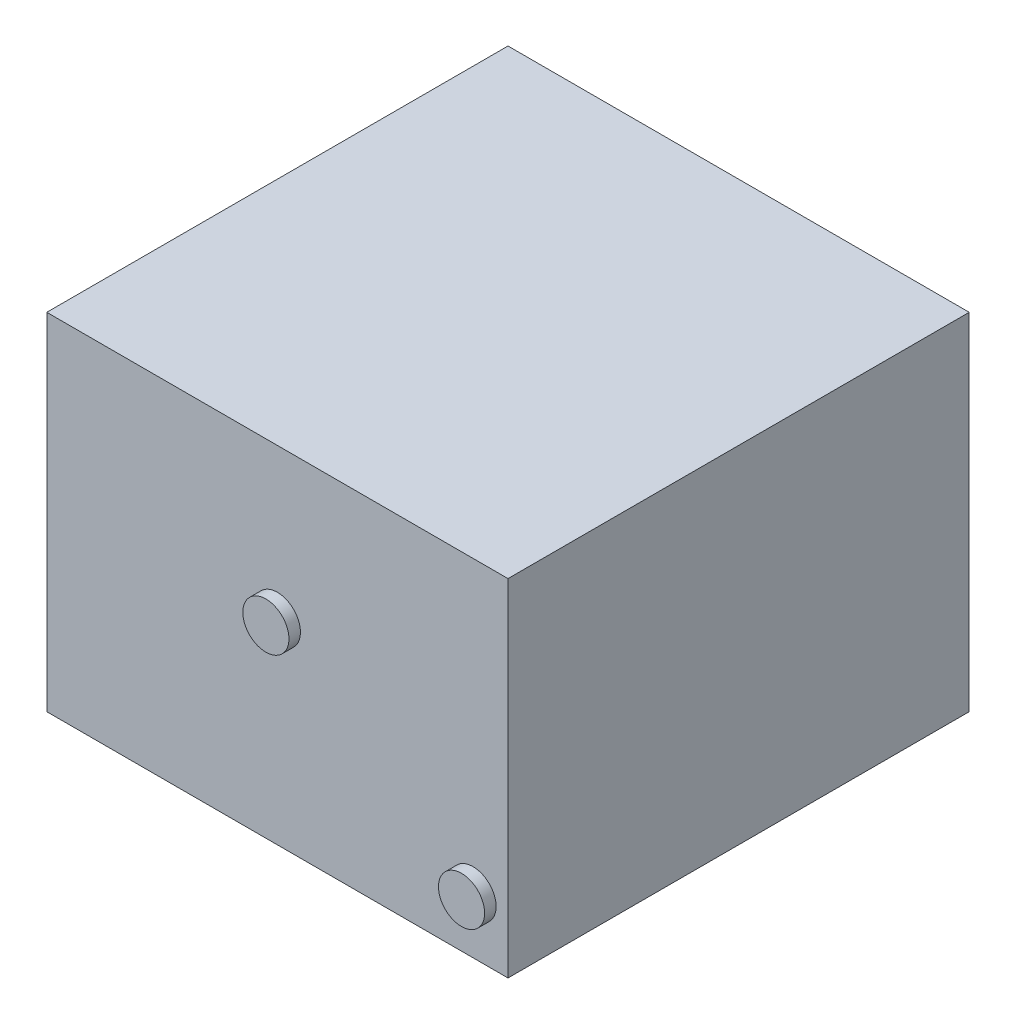
ISO-10303-21;
HEADER;
FILE_DESCRIPTION(('STEP AP214'),'2;1');
FILE_NAME('part.step','',(''),(''),'','','');
FILE_SCHEMA(('AUTOMOTIVE_DESIGN { 1 0 10303 214 1 1 1 1 }'));
ENDSEC;
DATA;
#1=APPLICATION_CONTEXT('core data for automotive mechanical design processes');
#2=APPLICATION_PROTOCOL_DEFINITION('international standard','automotive_design',2000,#1);
#3=PRODUCT_CONTEXT('',#1,'mechanical');
#4=PRODUCT('Part','Part','',(#3));
#5=PRODUCT_RELATED_PRODUCT_CATEGORY('part','',(#4));
#6=PRODUCT_DEFINITION_FORMATION('','',#4);
#7=PRODUCT_DEFINITION_CONTEXT('part definition',#1,'design');
#8=PRODUCT_DEFINITION('design','',#6,#7);
#9=PRODUCT_DEFINITION_SHAPE('','',#8);
#10=(LENGTH_UNIT() NAMED_UNIT(*) SI_UNIT(.MILLI.,.METRE.));
#11=(NAMED_UNIT(*) PLANE_ANGLE_UNIT() SI_UNIT($,.RADIAN.));
#12=(NAMED_UNIT(*) SI_UNIT($,.STERADIAN.) SOLID_ANGLE_UNIT());
#13=UNCERTAINTY_MEASURE_WITH_UNIT(LENGTH_MEASURE(1.E-05),#10,'distance_accuracy_value','');
#14=(GEOMETRIC_REPRESENTATION_CONTEXT(3) GLOBAL_UNCERTAINTY_ASSIGNED_CONTEXT((#13)) GLOBAL_UNIT_ASSIGNED_CONTEXT((#10,
#11,#12)) REPRESENTATION_CONTEXT('',''));
#15=CARTESIAN_POINT('',(0.,0.,0.));
#16=DIRECTION('',(0.,0.,1.));
#17=DIRECTION('',(1.,0.,0.));
#18=AXIS2_PLACEMENT_3D('',#15,#16,#17);
#19=CARTESIAN_POINT('',(100.,-75.,100.));
#20=DIRECTION('',(-1.,0.,0.));
#21=DIRECTION('',(0.,0.,1.));
#22=AXIS2_PLACEMENT_3D('',#19,#20,#21);
#23=PLANE('',#22);
#24=DIRECTION('',(0.,1.,0.));
#25=VECTOR('',#24,1.);
#26=CARTESIAN_POINT('',(100.,-75.,-100.));
#27=LINE('',#26,#25);
#28=CARTESIAN_POINT('',(100.,-75.,-100.));
#29=VERTEX_POINT('',#28);
#30=CARTESIAN_POINT('',(100.,75.,-100.));
#31=VERTEX_POINT('',#30);
#32=EDGE_CURVE('E111',#29,#31,#27,.T.);
#33=ORIENTED_EDGE('',*,*,#32,.T.);
#34=DIRECTION('',(0.,0.,-1.));
#35=VECTOR('',#34,1.);
#36=CARTESIAN_POINT('',(100.,75.,100.));
#37=LINE('',#36,#35);
#38=CARTESIAN_POINT('',(100.,75.,100.));
#39=VERTEX_POINT('',#38);
#40=EDGE_CURVE('E100',#39,#31,#37,.T.);
#41=ORIENTED_EDGE('',*,*,#40,.F.);
#42=DIRECTION('',(0.,1.,0.));
#43=VECTOR('',#42,1.);
#44=CARTESIAN_POINT('',(100.,-75.,100.));
#45=LINE('',#44,#43);
#46=CARTESIAN_POINT('',(100.,-75.,100.));
#47=VERTEX_POINT('',#46);
#48=EDGE_CURVE('E92',#47,#39,#45,.T.);
#49=ORIENTED_EDGE('',*,*,#48,.F.);
#50=DIRECTION('',(0.,0.,-1.));
#51=VECTOR('',#50,1.);
#52=CARTESIAN_POINT('',(100.,-75.,100.));
#53=LINE('',#52,#51);
#54=EDGE_CURVE('E107',#47,#29,#53,.T.);
#55=ORIENTED_EDGE('',*,*,#54,.T.);
#56=EDGE_LOOP('',(#33,#41,#49,#55));
#57=FACE_BOUND('',#56,.T.);
#58=ADVANCED_FACE('F39',(#57),#23,.F.);
#59=CARTESIAN_POINT('',(-100.,75.,100.));
#60=DIRECTION('',(0.,-1.,0.));
#61=DIRECTION('',(0.,0.,-1.));
#62=AXIS2_PLACEMENT_3D('',#59,#60,#61);
#63=PLANE('',#62);
#64=DIRECTION('',(-1.,0.,0.));
#65=VECTOR('',#64,1.);
#66=CARTESIAN_POINT('',(-100.,75.,-100.));
#67=LINE('',#66,#65);
#68=CARTESIAN_POINT('',(-100.,75.,-100.));
#69=VERTEX_POINT('',#68);
#70=EDGE_CURVE('E98',#31,#69,#67,.T.);
#71=ORIENTED_EDGE('',*,*,#70,.T.);
#72=DIRECTION('',(0.,0.,-1.));
#73=VECTOR('',#72,1.);
#74=CARTESIAN_POINT('',(-100.,75.,100.));
#75=LINE('',#74,#73);
#76=CARTESIAN_POINT('',(-100.,75.,100.));
#77=VERTEX_POINT('',#76);
#78=EDGE_CURVE('E96',#77,#69,#75,.T.);
#79=ORIENTED_EDGE('',*,*,#78,.F.);
#80=DIRECTION('',(-1.,0.,0.));
#81=VECTOR('',#80,1.);
#82=CARTESIAN_POINT('',(-100.,75.,100.));
#83=LINE('',#82,#81);
#84=EDGE_CURVE('E87',#39,#77,#83,.T.);
#85=ORIENTED_EDGE('',*,*,#84,.F.);
#86=ORIENTED_EDGE('',*,*,#40,.T.);
#87=EDGE_LOOP('',(#71,#79,#85,#86));
#88=FACE_BOUND('',#87,.T.);
#89=ADVANCED_FACE('F97',(#88),#63,.F.);
#90=CARTESIAN_POINT('',(-100.,-75.,100.));
#91=DIRECTION('',(1.,0.,0.));
#92=DIRECTION('',(0.,0.,-1.));
#93=AXIS2_PLACEMENT_3D('',#90,#91,#92);
#94=PLANE('',#93);
#95=DIRECTION('',(0.,-1.,0.));
#96=VECTOR('',#95,1.);
#97=CARTESIAN_POINT('',(-100.,-75.,-100.));
#98=LINE('',#97,#96);
#99=CARTESIAN_POINT('',(-100.,-75.,-100.));
#100=VERTEX_POINT('',#99);
#101=EDGE_CURVE('E73',#69,#100,#98,.T.);
#102=ORIENTED_EDGE('',*,*,#101,.T.);
#103=DIRECTION('',(0.,0.,-1.));
#104=VECTOR('',#103,1.);
#105=CARTESIAN_POINT('',(-100.,-75.,100.));
#106=LINE('',#105,#104);
#107=CARTESIAN_POINT('',(-100.,-75.,100.));
#108=VERTEX_POINT('',#107);
#109=EDGE_CURVE('E101',#108,#100,#106,.T.);
#110=ORIENTED_EDGE('',*,*,#109,.F.);
#111=DIRECTION('',(0.,-1.,0.));
#112=VECTOR('',#111,1.);
#113=CARTESIAN_POINT('',(-100.,-75.,100.));
#114=LINE('',#113,#112);
#115=EDGE_CURVE('E90',#77,#108,#114,.T.);
#116=ORIENTED_EDGE('',*,*,#115,.F.);
#117=ORIENTED_EDGE('',*,*,#78,.T.);
#118=EDGE_LOOP('',(#102,#110,#116,#117));
#119=FACE_BOUND('',#118,.T.);
#120=ADVANCED_FACE('F103',(#119),#94,.F.);
#121=CARTESIAN_POINT('',(-100.,-75.,100.));
#122=DIRECTION('',(0.,1.,0.));
#123=DIRECTION('',(0.,0.,1.));
#124=AXIS2_PLACEMENT_3D('',#121,#122,#123);
#125=PLANE('',#124);
#126=DIRECTION('',(1.,0.,0.));
#127=VECTOR('',#126,1.);
#128=CARTESIAN_POINT('',(-100.,-75.,-100.));
#129=LINE('',#128,#127);
#130=EDGE_CURVE('E79',#100,#29,#129,.T.);
#131=ORIENTED_EDGE('',*,*,#130,.T.);
#132=ORIENTED_EDGE('',*,*,#54,.F.);
#133=DIRECTION('',(1.,0.,0.));
#134=VECTOR('',#133,1.);
#135=CARTESIAN_POINT('',(-100.,-75.,100.));
#136=LINE('',#135,#134);
#137=EDGE_CURVE('E56',#108,#47,#136,.T.);
#138=ORIENTED_EDGE('',*,*,#137,.F.);
#139=ORIENTED_EDGE('',*,*,#109,.T.);
#140=EDGE_LOOP('',(#131,#132,#138,#139));
#141=FACE_BOUND('',#140,.T.);
#142=ADVANCED_FACE('F149',(#141),#125,.F.);
#143=CARTESIAN_POINT('',(0.,0.,100.));
#144=DIRECTION('',(0.,0.,-1.));
#145=DIRECTION('',(-1.,0.,0.));
#146=AXIS2_PLACEMENT_3D('',#143,#144,#145);
#147=PLANE('',#146);
#148=CARTESIAN_POINT('',(0.,9.85281374238614,100.));
#149=DIRECTION('',(0.,0.,-1.));
#150=DIRECTION('',(-1.,0.,0.));
#151=AXIS2_PLACEMENT_3D('',#148,#149,#150);
#152=CIRCLE('',#151,10.);
#153=CARTESIAN_POINT('',(-10.,9.85281374238614,100.));
#154=VERTEX_POINT('',#153);
#155=EDGE_CURVE('E132',#154,#154,#152,.F.);
#156=ORIENTED_EDGE('',*,*,#155,.F.);
#157=EDGE_LOOP('',(#156));
#158=FACE_BOUND('',#157,.T.);
#159=CARTESIAN_POINT('',(84.8528137423853,-50.7563389307468,100.));
#160=DIRECTION('',(0.,0.,-1.));
#161=DIRECTION('',(-1.,0.,0.));
#162=AXIS2_PLACEMENT_3D('',#159,#160,#161);
#163=CIRCLE('',#162,9.99999999999999);
#164=CARTESIAN_POINT('',(74.8528137423853,-50.7563389307468,100.));
#165=VERTEX_POINT('',#164);
#166=EDGE_CURVE('E128',#165,#165,#163,.F.);
#167=ORIENTED_EDGE('',*,*,#166,.F.);
#168=EDGE_LOOP('',(#167));
#169=FACE_BOUND('',#168,.T.);
#170=ORIENTED_EDGE('',*,*,#48,.T.);
#171=ORIENTED_EDGE('',*,*,#84,.T.);
#172=ORIENTED_EDGE('',*,*,#115,.T.);
#173=ORIENTED_EDGE('',*,*,#137,.T.);
#174=EDGE_LOOP('',(#170,#171,#172,#173));
#175=FACE_BOUND('',#174,.T.);
#176=ADVANCED_FACE('F88',(#158,#169,#175),#147,.F.);
#177=CARTESIAN_POINT('',(0.,0.,-100.));
#178=DIRECTION('',(0.,0.,-1.));
#179=DIRECTION('',(-1.,0.,0.));
#180=AXIS2_PLACEMENT_3D('',#177,#178,#179);
#181=PLANE('',#180);
#182=CARTESIAN_POINT('',(0.,9.85281374238614,-100.));
#183=DIRECTION('',(0.,0.,-1.));
#184=DIRECTION('',(-1.,0.,0.));
#185=AXIS2_PLACEMENT_3D('',#182,#183,#184);
#186=CIRCLE('',#185,10.);
#187=CARTESIAN_POINT('',(-10.,9.85281374238614,-100.));
#188=VERTEX_POINT('',#187);
#189=EDGE_CURVE('E11',#188,#188,#186,.T.);
#190=ORIENTED_EDGE('',*,*,#189,.F.);
#191=EDGE_LOOP('',(#190));
#192=FACE_BOUND('',#191,.T.);
#193=CARTESIAN_POINT('',(84.8528137423853,-50.7563389307468,-100.));
#194=DIRECTION('',(0.,0.,-1.));
#195=DIRECTION('',(-1.,0.,0.));
#196=AXIS2_PLACEMENT_3D('',#193,#194,#195);
#197=CIRCLE('',#196,9.99999999999999);
#198=CARTESIAN_POINT('',(74.8528137423853,-50.7563389307468,-100.));
#199=VERTEX_POINT('',#198);
#200=EDGE_CURVE('E48',#199,#199,#197,.T.);
#201=ORIENTED_EDGE('',*,*,#200,.F.);
#202=EDGE_LOOP('',(#201));
#203=FACE_BOUND('',#202,.T.);
#204=ORIENTED_EDGE('',*,*,#32,.F.);
#205=ORIENTED_EDGE('',*,*,#130,.F.);
#206=ORIENTED_EDGE('',*,*,#101,.F.);
#207=ORIENTED_EDGE('',*,*,#70,.F.);
#208=EDGE_LOOP('',(#204,#205,#206,#207));
#209=FACE_BOUND('',#208,.T.);
#210=ADVANCED_FACE('F141',(#192,#203,#209),#181,.T.);
#211=CARTESIAN_POINT('',(84.8528137423853,-50.7563389307468,105.));
#212=DIRECTION('',(0.,0.,-1.));
#213=DIRECTION('',(-1.,0.,0.));
#214=AXIS2_PLACEMENT_3D('',#211,#212,#213);
#215=CYLINDRICAL_SURFACE('',#214,9.99999999999999);
#216=CARTESIAN_POINT('',(84.8528137423853,-50.7563389307468,105.));
#217=DIRECTION('',(0.,0.,1.));
#218=DIRECTION('',(1.,0.,0.));
#219=AXIS2_PLACEMENT_3D('',#216,#217,#218);
#220=CIRCLE('',#219,9.99999999999999);
#221=CARTESIAN_POINT('',(94.8528137423853,-50.7563389307468,105.));
#222=VERTEX_POINT('',#221);
#223=EDGE_CURVE('E115',#222,#222,#220,.T.);
#224=ORIENTED_EDGE('',*,*,#223,.F.);
#225=EDGE_LOOP('',(#224));
#226=FACE_BOUND('',#225,.T.);
#227=ORIENTED_EDGE('',*,*,#166,.T.);
#228=EDGE_LOOP('',(#227));
#229=FACE_BOUND('',#228,.T.);
#230=ADVANCED_FACE('F144',(#226,#229),#215,.T.);
#231=CARTESIAN_POINT('',(84.8528137423853,-50.7563389307468,105.));
#232=DIRECTION('',(0.,0.,1.));
#233=DIRECTION('',(1.,0.,0.));
#234=AXIS2_PLACEMENT_3D('',#231,#232,#233);
#235=PLANE('',#234);
#236=ORIENTED_EDGE('',*,*,#223,.T.);
#237=EDGE_LOOP('',(#236));
#238=FACE_BOUND('',#237,.T.);
#239=ADVANCED_FACE('F189',(#238),#235,.T.);
#240=CARTESIAN_POINT('',(0.,9.85281374238614,105.));
#241=DIRECTION('',(0.,0.,-1.));
#242=DIRECTION('',(-1.,0.,0.));
#243=AXIS2_PLACEMENT_3D('',#240,#241,#242);
#244=CYLINDRICAL_SURFACE('',#243,10.);
#245=CARTESIAN_POINT('',(0.,9.85281374238614,105.));
#246=DIRECTION('',(0.,0.,1.));
#247=DIRECTION('',(1.,0.,0.));
#248=AXIS2_PLACEMENT_3D('',#245,#246,#247);
#249=CIRCLE('',#248,10.);
#250=CARTESIAN_POINT('',(10.,9.85281374238614,105.));
#251=VERTEX_POINT('',#250);
#252=EDGE_CURVE('E275',#251,#251,#249,.T.);
#253=ORIENTED_EDGE('',*,*,#252,.F.);
#254=EDGE_LOOP('',(#253));
#255=FACE_BOUND('',#254,.T.);
#256=ORIENTED_EDGE('',*,*,#155,.T.);
#257=EDGE_LOOP('',(#256));
#258=FACE_BOUND('',#257,.T.);
#259=ADVANCED_FACE('F199',(#255,#258),#244,.T.);
#260=CARTESIAN_POINT('',(0.,9.85281374238614,105.));
#261=DIRECTION('',(0.,0.,1.));
#262=DIRECTION('',(1.,0.,0.));
#263=AXIS2_PLACEMENT_3D('',#260,#261,#262);
#264=PLANE('',#263);
#265=ORIENTED_EDGE('',*,*,#252,.T.);
#266=EDGE_LOOP('',(#265));
#267=FACE_BOUND('',#266,.T.);
#268=ADVANCED_FACE('F209',(#267),#264,.T.);
#269=CARTESIAN_POINT('',(84.8528137423853,-50.7563389307468,-105.));
#270=DIRECTION('',(0.,0.,1.));
#271=DIRECTION('',(1.,0.,0.));
#272=AXIS2_PLACEMENT_3D('',#269,#270,#271);
#273=CYLINDRICAL_SURFACE('',#272,9.99999999999999);
#274=CARTESIAN_POINT('',(84.8528137423853,-50.7563389307468,-105.));
#275=DIRECTION('',(0.,0.,1.));
#276=DIRECTION('',(1.,0.,0.));
#277=AXIS2_PLACEMENT_3D('',#274,#275,#276);
#278=CIRCLE('',#277,9.99999999999999);
#279=CARTESIAN_POINT('',(94.8528137423853,-50.7563389307468,-105.));
#280=VERTEX_POINT('',#279);
#281=EDGE_CURVE('E271',#280,#280,#278,.T.);
#282=ORIENTED_EDGE('',*,*,#281,.T.);
#283=EDGE_LOOP('',(#282));
#284=FACE_BOUND('',#283,.T.);
#285=ORIENTED_EDGE('',*,*,#200,.T.);
#286=EDGE_LOOP('',(#285));
#287=FACE_BOUND('',#286,.T.);
#288=ADVANCED_FACE('F139',(#284,#287),#273,.T.);
#289=CARTESIAN_POINT('',(84.8528137423853,-50.7563389307468,-105.));
#290=DIRECTION('',(0.,0.,-1.));
#291=DIRECTION('',(1.,0.,0.));
#292=AXIS2_PLACEMENT_3D('',#289,#290,#291);
#293=PLANE('',#292);
#294=ORIENTED_EDGE('',*,*,#281,.F.);
#295=EDGE_LOOP('',(#294));
#296=FACE_BOUND('',#295,.T.);
#297=ADVANCED_FACE('F233',(#296),#293,.T.);
#298=CARTESIAN_POINT('',(0.,9.85281374238614,-105.));
#299=DIRECTION('',(0.,0.,1.));
#300=DIRECTION('',(1.,0.,0.));
#301=AXIS2_PLACEMENT_3D('',#298,#299,#300);
#302=CYLINDRICAL_SURFACE('',#301,10.);
#303=CARTESIAN_POINT('',(0.,9.85281374238614,-105.));
#304=DIRECTION('',(0.,0.,1.));
#305=DIRECTION('',(1.,0.,0.));
#306=AXIS2_PLACEMENT_3D('',#303,#304,#305);
#307=CIRCLE('',#306,10.);
#308=CARTESIAN_POINT('',(10.,9.85281374238614,-105.));
#309=VERTEX_POINT('',#308);
#310=EDGE_CURVE('E269',#309,#309,#307,.T.);
#311=ORIENTED_EDGE('',*,*,#310,.T.);
#312=EDGE_LOOP('',(#311));
#313=FACE_BOUND('',#312,.T.);
#314=ORIENTED_EDGE('',*,*,#189,.T.);
#315=EDGE_LOOP('',(#314));
#316=FACE_BOUND('',#315,.T.);
#317=ADVANCED_FACE('F243',(#313,#316),#302,.T.);
#318=CARTESIAN_POINT('',(0.,9.85281374238614,-105.));
#319=DIRECTION('',(0.,0.,-1.));
#320=DIRECTION('',(1.,0.,0.));
#321=AXIS2_PLACEMENT_3D('',#318,#319,#320);
#322=PLANE('',#321);
#323=ORIENTED_EDGE('',*,*,#310,.F.);
#324=EDGE_LOOP('',(#323));
#325=FACE_BOUND('',#324,.T.);
#326=ADVANCED_FACE('F253',(#325),#322,.T.);
#327=CLOSED_SHELL('',(#58,#89,#120,#142,#176,#210,#230,#239,#259,#268,#288,#297,#317,#326));
#328=MANIFOLD_SOLID_BREP('B2',#327);
#329=ADVANCED_BREP_SHAPE_REPRESENTATION('',(#18,#328),#14);
#330=SHAPE_DEFINITION_REPRESENTATION(#9,#329);
ENDSEC;
END-ISO-10303-21;
